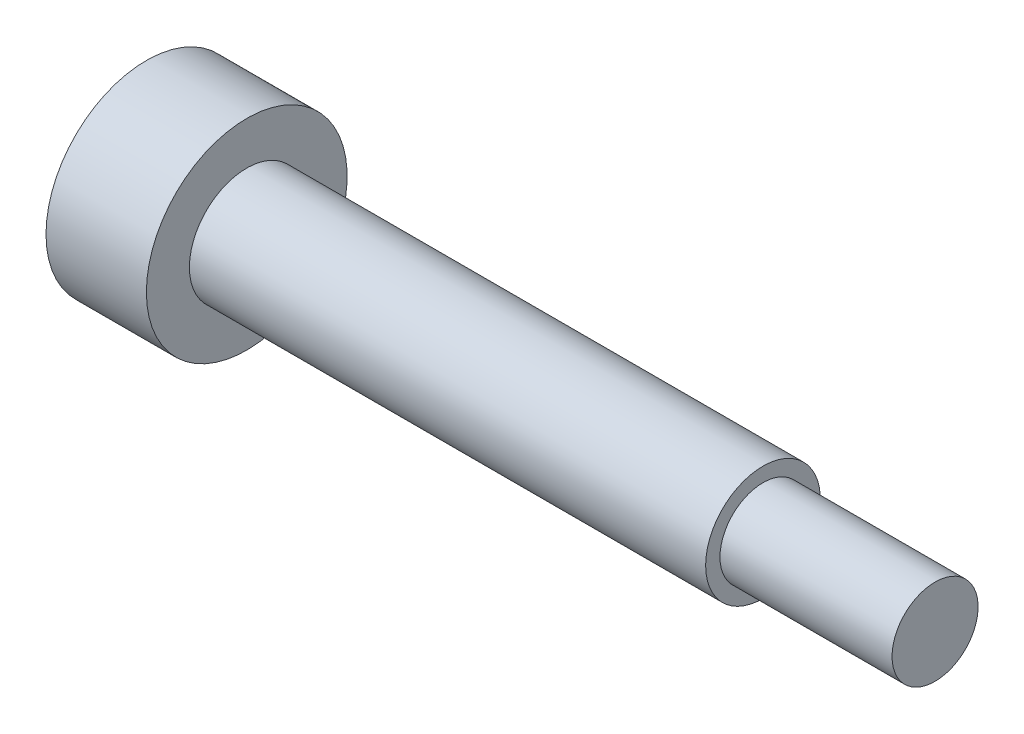
ISO-10303-21;
HEADER;
FILE_DESCRIPTION(('STEP AP214'),'2;1');
FILE_NAME('part.step','',(''),(''),'','','');
FILE_SCHEMA(('AUTOMOTIVE_DESIGN { 1 0 10303 214 1 1 1 1 }'));
ENDSEC;
DATA;
#1=APPLICATION_CONTEXT('core data for automotive mechanical design processes');
#2=APPLICATION_PROTOCOL_DEFINITION('international standard','automotive_design',2000,#1);
#3=PRODUCT_CONTEXT('',#1,'mechanical');
#4=PRODUCT('Part','Part','',(#3));
#5=PRODUCT_RELATED_PRODUCT_CATEGORY('part','',(#4));
#6=PRODUCT_DEFINITION_FORMATION('','',#4);
#7=PRODUCT_DEFINITION_CONTEXT('part definition',#1,'design');
#8=PRODUCT_DEFINITION('design','',#6,#7);
#9=PRODUCT_DEFINITION_SHAPE('','',#8);
#10=(LENGTH_UNIT() NAMED_UNIT(*) SI_UNIT(.MILLI.,.METRE.));
#11=(NAMED_UNIT(*) PLANE_ANGLE_UNIT() SI_UNIT($,.RADIAN.));
#12=(NAMED_UNIT(*) SI_UNIT($,.STERADIAN.) SOLID_ANGLE_UNIT());
#13=UNCERTAINTY_MEASURE_WITH_UNIT(LENGTH_MEASURE(1.E-05),#10,'distance_accuracy_value','');
#14=(GEOMETRIC_REPRESENTATION_CONTEXT(3) GLOBAL_UNCERTAINTY_ASSIGNED_CONTEXT((#13)) GLOBAL_UNIT_ASSIGNED_CONTEXT((#10,
#11,#12)) REPRESENTATION_CONTEXT('',''));
#15=CARTESIAN_POINT('',(0.,0.,0.));
#16=DIRECTION('',(0.,0.,1.));
#17=DIRECTION('',(1.,0.,0.));
#18=AXIS2_PLACEMENT_3D('',#15,#16,#17);
#19=CARTESIAN_POINT('',(0.,0.,0.));
#20=DIRECTION('',(1.,0.,0.));
#21=DIRECTION('',(0.,0.,-1.));
#22=AXIS2_PLACEMENT_3D('',#19,#20,#21);
#23=PLANE('',#22);
#24=DIRECTION('',(0.,-0.5,-0.866025403784439));
#25=VECTOR('',#24,1.);
#26=CARTESIAN_POINT('',(0.,2.88675134594813,0.));
#27=LINE('',#26,#25);
#28=CARTESIAN_POINT('',(0.,2.88675134594813,0.));
#29=VERTEX_POINT('',#28);
#30=CARTESIAN_POINT('',(0.,1.44337567297406,-2.5));
#31=VERTEX_POINT('',#30);
#32=EDGE_CURVE('E125',#29,#31,#27,.T.);
#33=ORIENTED_EDGE('',*,*,#32,.F.);
#34=DIRECTION('',(0.,0.5,-0.866025403784439));
#35=VECTOR('',#34,1.);
#36=CARTESIAN_POINT('',(0.,1.44337567297406,2.5));
#37=LINE('',#36,#35);
#38=CARTESIAN_POINT('',(0.,1.44337567297406,2.5));
#39=VERTEX_POINT('',#38);
#40=EDGE_CURVE('E51',#39,#29,#37,.T.);
#41=ORIENTED_EDGE('',*,*,#40,.F.);
#42=DIRECTION('',(0.,1.,0.));
#43=VECTOR('',#42,1.);
#44=CARTESIAN_POINT('',(0.,-1.44337567297407,2.5));
#45=LINE('',#44,#43);
#46=CARTESIAN_POINT('',(0.,-1.44337567297407,2.5));
#47=VERTEX_POINT('',#46);
#48=EDGE_CURVE('E134',#47,#39,#45,.T.);
#49=ORIENTED_EDGE('',*,*,#48,.F.);
#50=DIRECTION('',(0.,0.5,0.866025403784438));
#51=VECTOR('',#50,1.);
#52=CARTESIAN_POINT('',(0.,-2.88675134594813,0.));
#53=LINE('',#52,#51);
#54=CARTESIAN_POINT('',(0.,-2.88675134594813,0.));
#55=VERTEX_POINT('',#54);
#56=EDGE_CURVE('E132',#55,#47,#53,.T.);
#57=ORIENTED_EDGE('',*,*,#56,.F.);
#58=DIRECTION('',(0.,-0.5,0.866025403784439));
#59=VECTOR('',#58,1.);
#60=CARTESIAN_POINT('',(0.,-1.44337567297406,-2.5));
#61=LINE('',#60,#59);
#62=CARTESIAN_POINT('',(0.,-1.44337567297406,-2.5));
#63=VERTEX_POINT('',#62);
#64=EDGE_CURVE('E99',#63,#55,#61,.T.);
#65=ORIENTED_EDGE('',*,*,#64,.F.);
#66=DIRECTION('',(0.,-1.,0.));
#67=VECTOR('',#66,1.);
#68=CARTESIAN_POINT('',(0.,1.44337567297406,-2.5));
#69=LINE('',#68,#67);
#70=EDGE_CURVE('E128',#31,#63,#69,.T.);
#71=ORIENTED_EDGE('',*,*,#70,.F.);
#72=EDGE_LOOP('',(#33,#41,#49,#57,#65,#71));
#73=FACE_BOUND('',#72,.T.);
#74=CARTESIAN_POINT('',(0.,0.,0.));
#75=DIRECTION('',(-1.,0.,0.));
#76=DIRECTION('',(0.,0.,1.));
#77=AXIS2_PLACEMENT_3D('',#74,#75,#76);
#78=CIRCLE('',#77,3.5);
#79=CARTESIAN_POINT('',(0.,0.,3.5));
#80=VERTEX_POINT('',#79);
#81=EDGE_CURVE('E11',#80,#80,#78,.T.);
#82=ORIENTED_EDGE('',*,*,#81,.T.);
#83=EDGE_LOOP('',(#82));
#84=FACE_BOUND('',#83,.T.);
#85=ADVANCED_FACE('F37',(#73,#84),#23,.F.);
#86=CARTESIAN_POINT('',(0.,0.,0.));
#87=DIRECTION('',(-1.,0.,0.));
#88=DIRECTION('',(0.,0.,1.));
#89=AXIS2_PLACEMENT_3D('',#86,#87,#88);
#90=CYLINDRICAL_SURFACE('',#89,3.5);
#91=ORIENTED_EDGE('',*,*,#81,.F.);
#92=EDGE_LOOP('',(#91));
#93=FACE_BOUND('',#92,.T.);
#94=CARTESIAN_POINT('',(3.5,0.,0.));
#95=DIRECTION('',(-1.,0.,0.));
#96=DIRECTION('',(0.,0.,1.));
#97=AXIS2_PLACEMENT_3D('',#94,#95,#96);
#98=CIRCLE('',#97,3.5);
#99=CARTESIAN_POINT('',(3.5,0.,3.5));
#100=VERTEX_POINT('',#99);
#101=EDGE_CURVE('E44',#100,#100,#98,.T.);
#102=ORIENTED_EDGE('',*,*,#101,.T.);
#103=EDGE_LOOP('',(#102));
#104=FACE_BOUND('',#103,.T.);
#105=ADVANCED_FACE('F157',(#93,#104),#90,.T.);
#106=CARTESIAN_POINT('',(3.5,3.5,0.));
#107=DIRECTION('',(-1.,0.,0.));
#108=DIRECTION('',(0.,0.,1.));
#109=AXIS2_PLACEMENT_3D('',#106,#107,#108);
#110=PLANE('',#109);
#111=ORIENTED_EDGE('',*,*,#101,.F.);
#112=EDGE_LOOP('',(#111));
#113=FACE_BOUND('',#112,.T.);
#114=CARTESIAN_POINT('',(3.5,0.,0.));
#115=DIRECTION('',(-1.,0.,0.));
#116=DIRECTION('',(0.,0.,1.));
#117=AXIS2_PLACEMENT_3D('',#114,#115,#116);
#118=CIRCLE('',#117,2.00000000000001);
#119=CARTESIAN_POINT('',(3.5,0.,2.00000000000001));
#120=VERTEX_POINT('',#119);
#121=EDGE_CURVE('E152',#120,#120,#118,.T.);
#122=ORIENTED_EDGE('',*,*,#121,.T.);
#123=EDGE_LOOP('',(#122));
#124=FACE_BOUND('',#123,.T.);
#125=ADVANCED_FACE('F159',(#113,#124),#110,.F.);
#126=CARTESIAN_POINT('',(0.,0.,0.));
#127=DIRECTION('',(-1.,0.,0.));
#128=DIRECTION('',(0.,0.,1.));
#129=AXIS2_PLACEMENT_3D('',#126,#127,#128);
#130=CYLINDRICAL_SURFACE('',#129,2.00000000000001);
#131=ORIENTED_EDGE('',*,*,#121,.F.);
#132=EDGE_LOOP('',(#131));
#133=FACE_BOUND('',#132,.T.);
#134=CARTESIAN_POINT('',(21.5,0.,0.));
#135=DIRECTION('',(-1.,0.,0.));
#136=DIRECTION('',(0.,0.,1.));
#137=AXIS2_PLACEMENT_3D('',#134,#135,#136);
#138=CIRCLE('',#137,2.00000000000001);
#139=CARTESIAN_POINT('',(21.5,0.,2.00000000000001));
#140=VERTEX_POINT('',#139);
#141=EDGE_CURVE('E149',#140,#140,#138,.T.);
#142=ORIENTED_EDGE('',*,*,#141,.T.);
#143=EDGE_LOOP('',(#142));
#144=FACE_BOUND('',#143,.T.);
#145=ADVANCED_FACE('F162',(#133,#144),#130,.T.);
#146=CARTESIAN_POINT('',(21.5,2.00000000000001,0.));
#147=DIRECTION('',(-1.,0.,0.));
#148=DIRECTION('',(0.,0.,1.));
#149=AXIS2_PLACEMENT_3D('',#146,#147,#148);
#150=PLANE('',#149);
#151=ORIENTED_EDGE('',*,*,#141,.F.);
#152=EDGE_LOOP('',(#151));
#153=FACE_BOUND('',#152,.T.);
#154=CARTESIAN_POINT('',(21.5,0.,0.));
#155=DIRECTION('',(-1.,0.,0.));
#156=DIRECTION('',(0.,0.,1.));
#157=AXIS2_PLACEMENT_3D('',#154,#155,#156);
#158=CIRCLE('',#157,1.50000000000001);
#159=CARTESIAN_POINT('',(21.5,0.,1.50000000000001));
#160=VERTEX_POINT('',#159);
#161=EDGE_CURVE('E146',#160,#160,#158,.T.);
#162=ORIENTED_EDGE('',*,*,#161,.T.);
#163=EDGE_LOOP('',(#162));
#164=FACE_BOUND('',#163,.T.);
#165=ADVANCED_FACE('F168',(#153,#164),#150,.F.);
#166=CARTESIAN_POINT('',(0.,0.,0.));
#167=DIRECTION('',(-1.,0.,0.));
#168=DIRECTION('',(0.,0.,1.));
#169=AXIS2_PLACEMENT_3D('',#166,#167,#168);
#170=CYLINDRICAL_SURFACE('',#169,1.50000000000001);
#171=ORIENTED_EDGE('',*,*,#161,.F.);
#172=EDGE_LOOP('',(#171));
#173=FACE_BOUND('',#172,.T.);
#174=CARTESIAN_POINT('',(27.5,0.,0.));
#175=DIRECTION('',(-1.,0.,0.));
#176=DIRECTION('',(0.,0.,1.));
#177=AXIS2_PLACEMENT_3D('',#174,#175,#176);
#178=CIRCLE('',#177,1.50000000000001);
#179=CARTESIAN_POINT('',(27.5,0.,1.50000000000001));
#180=VERTEX_POINT('',#179);
#181=EDGE_CURVE('E138',#180,#180,#178,.T.);
#182=ORIENTED_EDGE('',*,*,#181,.T.);
#183=EDGE_LOOP('',(#182));
#184=FACE_BOUND('',#183,.T.);
#185=ADVANCED_FACE('F174',(#173,#184),#170,.T.);
#186=CARTESIAN_POINT('',(27.5,1.50000000000001,0.));
#187=DIRECTION('',(-1.,0.,0.));
#188=DIRECTION('',(0.,0.,1.));
#189=AXIS2_PLACEMENT_3D('',#186,#187,#188);
#190=PLANE('',#189);
#191=ORIENTED_EDGE('',*,*,#181,.F.);
#192=EDGE_LOOP('',(#191));
#193=FACE_BOUND('',#192,.T.);
#194=ADVANCED_FACE('F180',(#193),#190,.F.);
#195=CARTESIAN_POINT('',(3.,1.44337567297406,2.5));
#196=DIRECTION('',(0.,0.866025403784439,0.5));
#197=DIRECTION('',(0.,-0.5,0.866025403784439));
#198=AXIS2_PLACEMENT_3D('',#195,#196,#197);
#199=PLANE('',#198);
#200=ORIENTED_EDGE('',*,*,#40,.T.);
#201=DIRECTION('',(-1.,0.,0.));
#202=VECTOR('',#201,1.);
#203=CARTESIAN_POINT('',(3.,2.88675134594813,0.));
#204=LINE('',#203,#202);
#205=CARTESIAN_POINT('',(3.,2.88675134594813,0.));
#206=VERTEX_POINT('',#205);
#207=EDGE_CURVE('E81',#206,#29,#204,.T.);
#208=ORIENTED_EDGE('',*,*,#207,.F.);
#209=DIRECTION('',(0.,0.5,-0.866025403784439));
#210=VECTOR('',#209,1.);
#211=CARTESIAN_POINT('',(3.,1.44337567297406,2.5));
#212=LINE('',#211,#210);
#213=CARTESIAN_POINT('',(3.,1.44337567297406,2.5));
#214=VERTEX_POINT('',#213);
#215=EDGE_CURVE('E136',#214,#206,#212,.T.);
#216=ORIENTED_EDGE('',*,*,#215,.F.);
#217=DIRECTION('',(-1.,0.,0.));
#218=VECTOR('',#217,1.);
#219=CARTESIAN_POINT('',(3.,1.44337567297406,2.5));
#220=LINE('',#219,#218);
#221=EDGE_CURVE('E59',#214,#39,#220,.T.);
#222=ORIENTED_EDGE('',*,*,#221,.T.);
#223=EDGE_LOOP('',(#200,#208,#216,#222));
#224=FACE_BOUND('',#223,.T.);
#225=ADVANCED_FACE('F185',(#224),#199,.F.);
#226=CARTESIAN_POINT('',(3.,-1.44337567297407,2.5));
#227=DIRECTION('',(0.,0.,1.));
#228=DIRECTION('',(1.,0.,0.));
#229=AXIS2_PLACEMENT_3D('',#226,#227,#228);
#230=PLANE('',#229);
#231=ORIENTED_EDGE('',*,*,#48,.T.);
#232=ORIENTED_EDGE('',*,*,#221,.F.);
#233=DIRECTION('',(0.,1.,0.));
#234=VECTOR('',#233,1.);
#235=CARTESIAN_POINT('',(3.,-1.44337567297407,2.5));
#236=LINE('',#235,#234);
#237=CARTESIAN_POINT('',(3.,-1.44337567297407,2.5));
#238=VERTEX_POINT('',#237);
#239=EDGE_CURVE('E111',#238,#214,#236,.T.);
#240=ORIENTED_EDGE('',*,*,#239,.F.);
#241=DIRECTION('',(-1.,0.,0.));
#242=VECTOR('',#241,1.);
#243=CARTESIAN_POINT('',(3.,-1.44337567297407,2.5));
#244=LINE('',#243,#242);
#245=EDGE_CURVE('E103',#238,#47,#244,.T.);
#246=ORIENTED_EDGE('',*,*,#245,.T.);
#247=EDGE_LOOP('',(#231,#232,#240,#246));
#248=FACE_BOUND('',#247,.T.);
#249=ADVANCED_FACE('F190',(#248),#230,.F.);
#250=CARTESIAN_POINT('',(3.,-2.88675134594813,0.));
#251=DIRECTION('',(0.,-0.866025403784439,0.5));
#252=DIRECTION('',(0.,-0.5,-0.866025403784439));
#253=AXIS2_PLACEMENT_3D('',#250,#251,#252);
#254=PLANE('',#253);
#255=ORIENTED_EDGE('',*,*,#56,.T.);
#256=ORIENTED_EDGE('',*,*,#245,.F.);
#257=DIRECTION('',(0.,0.5,0.866025403784438));
#258=VECTOR('',#257,1.);
#259=CARTESIAN_POINT('',(3.,-2.88675134594813,0.));
#260=LINE('',#259,#258);
#261=CARTESIAN_POINT('',(3.,-2.88675134594813,0.));
#262=VERTEX_POINT('',#261);
#263=EDGE_CURVE('E107',#262,#238,#260,.T.);
#264=ORIENTED_EDGE('',*,*,#263,.F.);
#265=DIRECTION('',(-1.,0.,0.));
#266=VECTOR('',#265,1.);
#267=CARTESIAN_POINT('',(3.,-2.88675134594813,0.));
#268=LINE('',#267,#266);
#269=EDGE_CURVE('E92',#262,#55,#268,.T.);
#270=ORIENTED_EDGE('',*,*,#269,.T.);
#271=EDGE_LOOP('',(#255,#256,#264,#270));
#272=FACE_BOUND('',#271,.T.);
#273=ADVANCED_FACE('F108',(#272),#254,.F.);
#274=CARTESIAN_POINT('',(3.,-1.44337567297406,-2.5));
#275=DIRECTION('',(0.,-0.866025403784439,-0.5));
#276=DIRECTION('',(0.,0.5,-0.866025403784439));
#277=AXIS2_PLACEMENT_3D('',#274,#275,#276);
#278=PLANE('',#277);
#279=ORIENTED_EDGE('',*,*,#64,.T.);
#280=ORIENTED_EDGE('',*,*,#269,.F.);
#281=DIRECTION('',(0.,-0.5,0.866025403784439));
#282=VECTOR('',#281,1.);
#283=CARTESIAN_POINT('',(3.,-1.44337567297406,-2.5));
#284=LINE('',#283,#282);
#285=CARTESIAN_POINT('',(3.,-1.44337567297406,-2.5));
#286=VERTEX_POINT('',#285);
#287=EDGE_CURVE('E96',#286,#262,#284,.T.);
#288=ORIENTED_EDGE('',*,*,#287,.F.);
#289=DIRECTION('',(-1.,0.,0.));
#290=VECTOR('',#289,1.);
#291=CARTESIAN_POINT('',(3.,-1.44337567297406,-2.5));
#292=LINE('',#291,#290);
#293=EDGE_CURVE('E104',#286,#63,#292,.T.);
#294=ORIENTED_EDGE('',*,*,#293,.T.);
#295=EDGE_LOOP('',(#279,#280,#288,#294));
#296=FACE_BOUND('',#295,.T.);
#297=ADVANCED_FACE('F94',(#296),#278,.F.);
#298=CARTESIAN_POINT('',(3.,1.44337567297406,-2.5));
#299=DIRECTION('',(0.,0.,-1.));
#300=DIRECTION('',(-1.,0.,0.));
#301=AXIS2_PLACEMENT_3D('',#298,#299,#300);
#302=PLANE('',#301);
#303=ORIENTED_EDGE('',*,*,#70,.T.);
#304=ORIENTED_EDGE('',*,*,#293,.F.);
#305=DIRECTION('',(0.,-1.,0.));
#306=VECTOR('',#305,1.);
#307=CARTESIAN_POINT('',(3.,1.44337567297406,-2.5));
#308=LINE('',#307,#306);
#309=CARTESIAN_POINT('',(3.,1.44337567297406,-2.5));
#310=VERTEX_POINT('',#309);
#311=EDGE_CURVE('E117',#310,#286,#308,.T.);
#312=ORIENTED_EDGE('',*,*,#311,.F.);
#313=DIRECTION('',(-1.,0.,0.));
#314=VECTOR('',#313,1.);
#315=CARTESIAN_POINT('',(3.,1.44337567297406,-2.5));
#316=LINE('',#315,#314);
#317=EDGE_CURVE('E141',#310,#31,#316,.T.);
#318=ORIENTED_EDGE('',*,*,#317,.T.);
#319=EDGE_LOOP('',(#303,#304,#312,#318));
#320=FACE_BOUND('',#319,.T.);
#321=ADVANCED_FACE('F216',(#320),#302,.F.);
#322=CARTESIAN_POINT('',(3.,2.88675134594813,0.));
#323=DIRECTION('',(0.,0.866025403784439,-0.5));
#324=DIRECTION('',(0.,0.5,0.866025403784439));
#325=AXIS2_PLACEMENT_3D('',#322,#323,#324);
#326=PLANE('',#325);
#327=ORIENTED_EDGE('',*,*,#32,.T.);
#328=ORIENTED_EDGE('',*,*,#317,.F.);
#329=DIRECTION('',(0.,-0.5,-0.866025403784439));
#330=VECTOR('',#329,1.);
#331=CARTESIAN_POINT('',(3.,2.88675134594813,0.));
#332=LINE('',#331,#330);
#333=EDGE_CURVE('E119',#206,#310,#332,.T.);
#334=ORIENTED_EDGE('',*,*,#333,.F.);
#335=ORIENTED_EDGE('',*,*,#207,.T.);
#336=EDGE_LOOP('',(#327,#328,#334,#335));
#337=FACE_BOUND('',#336,.T.);
#338=ADVANCED_FACE('F204',(#337),#326,.F.);
#339=CARTESIAN_POINT('',(3.,0.,0.));
#340=DIRECTION('',(-1.,0.,0.));
#341=DIRECTION('',(0.,0.,1.));
#342=AXIS2_PLACEMENT_3D('',#339,#340,#341);
#343=PLANE('',#342);
#344=ORIENTED_EDGE('',*,*,#215,.T.);
#345=ORIENTED_EDGE('',*,*,#333,.T.);
#346=ORIENTED_EDGE('',*,*,#311,.T.);
#347=ORIENTED_EDGE('',*,*,#287,.T.);
#348=ORIENTED_EDGE('',*,*,#263,.T.);
#349=ORIENTED_EDGE('',*,*,#239,.T.);
#350=EDGE_LOOP('',(#344,#345,#346,#347,#348,#349));
#351=FACE_BOUND('',#350,.T.);
#352=ADVANCED_FACE('F114',(#351),#343,.T.);
#353=CLOSED_SHELL('',(#85,#105,#125,#145,#165,#185,#194,#225,#249,#273,#297,#321,#338,#352));
#354=MANIFOLD_SOLID_BREP('B2',#353);
#355=ADVANCED_BREP_SHAPE_REPRESENTATION('',(#18,#354),#14);
#356=SHAPE_DEFINITION_REPRESENTATION(#9,#355);
ENDSEC;
END-ISO-10303-21;
